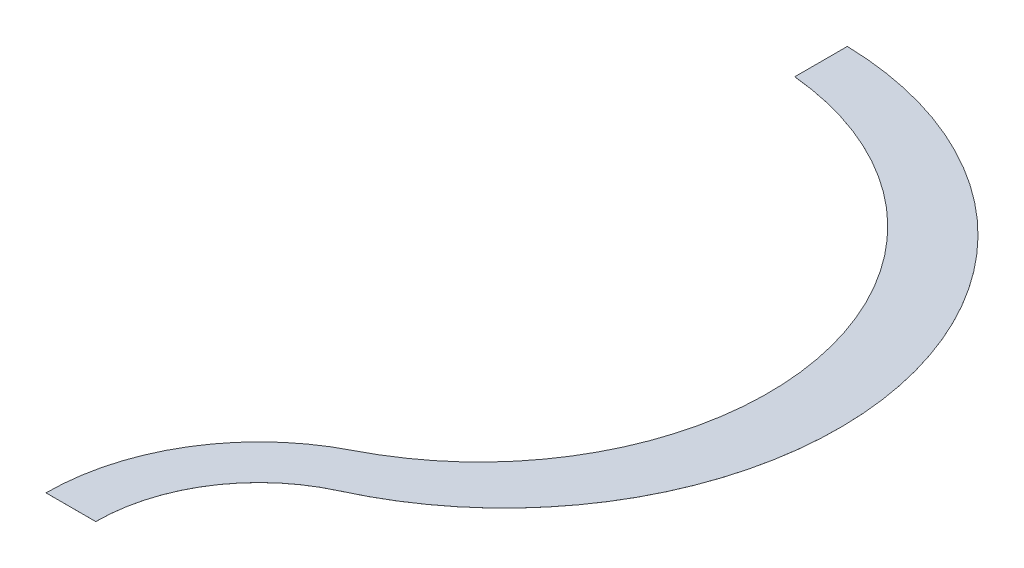
ISO-10303-21;
HEADER;
FILE_DESCRIPTION(('STEP AP214'),'2;1');
FILE_NAME('part.step','',(''),(''),'','','');
FILE_SCHEMA(('AUTOMOTIVE_DESIGN { 1 0 10303 214 1 1 1 1 }'));
ENDSEC;
DATA;
#1=APPLICATION_CONTEXT('core data for automotive mechanical design processes');
#2=APPLICATION_PROTOCOL_DEFINITION('international standard','automotive_design',2000,#1);
#3=PRODUCT_CONTEXT('',#1,'mechanical');
#4=PRODUCT('Part','Part','',(#3));
#5=PRODUCT_RELATED_PRODUCT_CATEGORY('part','',(#4));
#6=PRODUCT_DEFINITION_FORMATION('','',#4);
#7=PRODUCT_DEFINITION_CONTEXT('part definition',#1,'design');
#8=PRODUCT_DEFINITION('design','',#6,#7);
#9=PRODUCT_DEFINITION_SHAPE('','',#8);
#10=(LENGTH_UNIT() NAMED_UNIT(*) SI_UNIT(.MILLI.,.METRE.));
#11=(NAMED_UNIT(*) PLANE_ANGLE_UNIT() SI_UNIT($,.RADIAN.));
#12=(NAMED_UNIT(*) SI_UNIT($,.STERADIAN.) SOLID_ANGLE_UNIT());
#13=UNCERTAINTY_MEASURE_WITH_UNIT(LENGTH_MEASURE(1.E-05),#10,'distance_accuracy_value','');
#14=(GEOMETRIC_REPRESENTATION_CONTEXT(3) GLOBAL_UNCERTAINTY_ASSIGNED_CONTEXT((#13)) GLOBAL_UNIT_ASSIGNED_CONTEXT((#10,
#11,#12)) REPRESENTATION_CONTEXT('',''));
#15=CARTESIAN_POINT('',(0.,0.,0.));
#16=DIRECTION('',(0.,0.,1.));
#17=DIRECTION('',(1.,0.,0.));
#18=AXIS2_PLACEMENT_3D('',#15,#16,#17);
#19=CARTESIAN_POINT('',(378.845042115209,0.01,-791.249979553022));
#20=DIRECTION('',(0.,-1.,0.));
#21=DIRECTION('',(0.,0.,-1.));
#22=AXIS2_PLACEMENT_3D('',#19,#20,#21);
#23=CYLINDRICAL_SURFACE('',#22,81.1780801645515);
#24=CARTESIAN_POINT('',(378.845042115209,0.,-791.249979553022));
#25=DIRECTION('',(0.,-1.,0.));
#26=DIRECTION('',(0.,0.,-1.));
#27=AXIS2_PLACEMENT_3D('',#24,#25,#26);
#28=CIRCLE('',#27,81.1780801645515);
#29=CARTESIAN_POINT('',(297.666961950657,0.,-791.249979553022));
#30=VERTEX_POINT('',#29);
#31=CARTESIAN_POINT('',(342.105865491731,0.,-863.638608495911));
#32=VERTEX_POINT('',#31);
#33=EDGE_CURVE('E132',#30,#32,#28,.T.);
#34=ORIENTED_EDGE('',*,*,#33,.F.);
#35=DIRECTION('',(0.,-1.,0.));
#36=VECTOR('',#35,1.);
#37=CARTESIAN_POINT('',(297.666961950657,0.01,-791.249979553022));
#38=LINE('',#37,#36);
#39=CARTESIAN_POINT('',(297.666961950657,0.01,-791.249979553022));
#40=VERTEX_POINT('',#39);
#41=EDGE_CURVE('E11',#40,#30,#38,.T.);
#42=ORIENTED_EDGE('',*,*,#41,.F.);
#43=CARTESIAN_POINT('',(378.845042115209,0.01,-791.249979553022));
#44=DIRECTION('',(0.,-1.,0.));
#45=DIRECTION('',(0.,0.,-1.));
#46=AXIS2_PLACEMENT_3D('',#43,#44,#45);
#47=CIRCLE('',#46,81.1780801645515);
#48=CARTESIAN_POINT('',(342.105865491731,0.01,-863.638608495911));
#49=VERTEX_POINT('',#48);
#50=EDGE_CURVE('E150',#40,#49,#47,.T.);
#51=ORIENTED_EDGE('',*,*,#50,.T.);
#52=DIRECTION('',(0.,-1.,0.));
#53=VECTOR('',#52,1.);
#54=CARTESIAN_POINT('',(342.105865491731,0.01,-863.638608495911));
#55=LINE('',#54,#53);
#56=EDGE_CURVE('E42',#49,#32,#55,.T.);
#57=ORIENTED_EDGE('',*,*,#56,.T.);
#58=EDGE_LOOP('',(#34,#42,#51,#57));
#59=FACE_BOUND('',#58,.T.);
#60=ADVANCED_FACE('F39',(#59),#23,.T.);
#61=CARTESIAN_POINT('',(297.666961950657,0.01,-791.249979553022));
#62=DIRECTION('',(0.,0.,-1.));
#63=DIRECTION('',(-1.,0.,0.));
#64=AXIS2_PLACEMENT_3D('',#61,#62,#63);
#65=PLANE('',#64);
#66=DIRECTION('',(1.,0.,0.));
#67=VECTOR('',#66,1.);
#68=CARTESIAN_POINT('',(297.666961950657,0.,-791.249979553022));
#69=LINE('',#68,#67);
#70=CARTESIAN_POINT('',(316.601353193409,0.,-791.249979553022));
#71=VERTEX_POINT('',#70);
#72=EDGE_CURVE('E79',#30,#71,#69,.T.);
#73=ORIENTED_EDGE('',*,*,#72,.T.);
#74=DIRECTION('',(0.,-1.,0.));
#75=VECTOR('',#74,1.);
#76=CARTESIAN_POINT('',(316.601353193409,0.01,-791.249979553022));
#77=LINE('',#76,#75);
#78=CARTESIAN_POINT('',(316.601353193409,0.01,-791.249979553022));
#79=VERTEX_POINT('',#78);
#80=EDGE_CURVE('E49',#79,#71,#77,.T.);
#81=ORIENTED_EDGE('',*,*,#80,.F.);
#82=DIRECTION('',(1.,0.,0.));
#83=VECTOR('',#82,1.);
#84=CARTESIAN_POINT('',(297.666961950657,0.01,-791.249979553022));
#85=LINE('',#84,#83);
#86=EDGE_CURVE('E105',#40,#79,#85,.T.);
#87=ORIENTED_EDGE('',*,*,#86,.F.);
#88=ORIENTED_EDGE('',*,*,#41,.T.);
#89=EDGE_LOOP('',(#73,#81,#87,#88));
#90=FACE_BOUND('',#89,.T.);
#91=ADVANCED_FACE('F175',(#90),#65,.F.);
#92=CARTESIAN_POINT('',(378.726964475539,0.01,-791.249979553022));
#93=DIRECTION('',(0.,-1.,0.));
#94=DIRECTION('',(0.,0.,-1.));
#95=AXIS2_PLACEMENT_3D('',#92,#93,#94);
#96=CYLINDRICAL_SURFACE('',#95,62.1256112821295);
#97=CARTESIAN_POINT('',(378.726964475539,0.,-791.249979553022));
#98=DIRECTION('',(0.,-1.,0.));
#99=DIRECTION('',(0.,0.,-1.));
#100=AXIS2_PLACEMENT_3D('',#97,#98,#99);
#101=CIRCLE('',#100,62.1256112821295);
#102=CARTESIAN_POINT('',(352.905895621768,0.,-847.75541274689));
#103=VERTEX_POINT('',#102);
#104=EDGE_CURVE('E113',#71,#103,#101,.T.);
#105=ORIENTED_EDGE('',*,*,#104,.T.);
#106=DIRECTION('',(0.,-1.,0.));
#107=VECTOR('',#106,1.);
#108=CARTESIAN_POINT('',(352.905895621768,0.01,-847.75541274689));
#109=LINE('',#108,#107);
#110=CARTESIAN_POINT('',(352.905895621768,0.01,-847.75541274689));
#111=VERTEX_POINT('',#110);
#112=EDGE_CURVE('E110',#111,#103,#109,.T.);
#113=ORIENTED_EDGE('',*,*,#112,.F.);
#114=CARTESIAN_POINT('',(378.726964475539,0.01,-791.249979553022));
#115=DIRECTION('',(0.,-1.,0.));
#116=DIRECTION('',(0.,0.,-1.));
#117=AXIS2_PLACEMENT_3D('',#114,#115,#116);
#118=CIRCLE('',#117,62.1256112821295);
#119=EDGE_CURVE('E97',#79,#111,#118,.T.);
#120=ORIENTED_EDGE('',*,*,#119,.F.);
#121=ORIENTED_EDGE('',*,*,#80,.T.);
#122=EDGE_LOOP('',(#105,#113,#120,#121));
#123=FACE_BOUND('',#122,.T.);
#124=ADVANCED_FACE('F111',(#123),#96,.F.);
#125=CARTESIAN_POINT('',(299.967770082059,0.01,-963.60234894592));
#126=DIRECTION('',(0.,-1.,0.));
#127=DIRECTION('',(0.,0.,-1.));
#128=AXIS2_PLACEMENT_3D('',#125,#126,#127);
#129=CYLINDRICAL_SURFACE('',#128,127.369375292337);
#130=CARTESIAN_POINT('',(299.967770082059,0.,-963.60234894592));
#131=DIRECTION('',(0.,1.,0.));
#132=DIRECTION('',(0.,0.,1.));
#133=AXIS2_PLACEMENT_3D('',#130,#131,#132);
#134=CIRCLE('',#133,127.369375292337);
#135=CARTESIAN_POINT('',(303.015592938205,0.,-1090.9352533273));
#136=VERTEX_POINT('',#135);
#137=EDGE_CURVE('E144',#103,#136,#134,.T.);
#138=ORIENTED_EDGE('',*,*,#137,.T.);
#139=DIRECTION('',(0.,-1.,0.));
#140=VECTOR('',#139,1.);
#141=CARTESIAN_POINT('',(303.015592938205,0.01,-1090.9352533273));
#142=LINE('',#141,#140);
#143=CARTESIAN_POINT('',(303.015592938205,0.01,-1090.9352533273));
#144=VERTEX_POINT('',#143);
#145=EDGE_CURVE('E118',#144,#136,#142,.T.);
#146=ORIENTED_EDGE('',*,*,#145,.F.);
#147=CARTESIAN_POINT('',(299.967770082059,0.01,-963.60234894592));
#148=DIRECTION('',(0.,1.,0.));
#149=DIRECTION('',(0.,0.,1.));
#150=AXIS2_PLACEMENT_3D('',#147,#148,#149);
#151=CIRCLE('',#150,127.369375292337);
#152=EDGE_CURVE('E103',#111,#144,#151,.T.);
#153=ORIENTED_EDGE('',*,*,#152,.F.);
#154=ORIENTED_EDGE('',*,*,#112,.T.);
#155=EDGE_LOOP('',(#138,#146,#153,#154));
#156=FACE_BOUND('',#155,.T.);
#157=ADVANCED_FACE('F120',(#156),#129,.T.);
#158=CARTESIAN_POINT('',(303.015592938204,0.01,-1070.9352533273));
#159=DIRECTION('',(-1.,0.,0.));
#160=DIRECTION('',(0.,0.,1.));
#161=AXIS2_PLACEMENT_3D('',#158,#159,#160);
#162=PLANE('',#161);
#163=DIRECTION('',(0.,0.,-1.));
#164=VECTOR('',#163,1.);
#165=CARTESIAN_POINT('',(303.015592938204,0.,-1070.9352533273));
#166=LINE('',#165,#164);
#167=CARTESIAN_POINT('',(303.015592938204,0.,-1070.9352533273));
#168=VERTEX_POINT('',#167);
#169=EDGE_CURVE('E140',#168,#136,#166,.T.);
#170=ORIENTED_EDGE('',*,*,#169,.F.);
#171=DIRECTION('',(0.,-1.,0.));
#172=VECTOR('',#171,1.);
#173=CARTESIAN_POINT('',(303.015592938204,0.01,-1070.9352533273));
#174=LINE('',#173,#172);
#175=CARTESIAN_POINT('',(303.015592938204,0.01,-1070.9352533273));
#176=VERTEX_POINT('',#175);
#177=EDGE_CURVE('E155',#176,#168,#174,.T.);
#178=ORIENTED_EDGE('',*,*,#177,.F.);
#179=DIRECTION('',(0.,0.,-1.));
#180=VECTOR('',#179,1.);
#181=CARTESIAN_POINT('',(303.015592938204,0.01,-1070.9352533273));
#182=LINE('',#181,#180);
#183=EDGE_CURVE('E123',#176,#144,#182,.T.);
#184=ORIENTED_EDGE('',*,*,#183,.T.);
#185=ORIENTED_EDGE('',*,*,#145,.T.);
#186=EDGE_LOOP('',(#170,#178,#184,#185));
#187=FACE_BOUND('',#186,.T.);
#188=ADVANCED_FACE('F163',(#187),#162,.T.);
#189=CARTESIAN_POINT('',(292.389131940967,0.01,-961.597422710569));
#190=DIRECTION('',(0.,-1.,0.));
#191=DIRECTION('',(0.,0.,-1.));
#192=AXIS2_PLACEMENT_3D('',#189,#190,#191);
#193=CYLINDRICAL_SURFACE('',#192,109.853005772712);
#194=CARTESIAN_POINT('',(292.389131940967,0.,-961.597422710569));
#195=DIRECTION('',(0.,1.,0.));
#196=DIRECTION('',(0.,0.,1.));
#197=AXIS2_PLACEMENT_3D('',#194,#195,#196);
#198=CIRCLE('',#197,109.853005772712);
#199=EDGE_CURVE('E136',#32,#168,#198,.T.);
#200=ORIENTED_EDGE('',*,*,#199,.F.);
#201=ORIENTED_EDGE('',*,*,#56,.F.);
#202=CARTESIAN_POINT('',(292.389131940967,0.01,-961.597422710569));
#203=DIRECTION('',(0.,1.,0.));
#204=DIRECTION('',(0.,0.,1.));
#205=AXIS2_PLACEMENT_3D('',#202,#203,#204);
#206=CIRCLE('',#205,109.853005772712);
#207=EDGE_CURVE('E126',#49,#176,#206,.T.);
#208=ORIENTED_EDGE('',*,*,#207,.T.);
#209=ORIENTED_EDGE('',*,*,#177,.T.);
#210=EDGE_LOOP('',(#200,#201,#208,#209));
#211=FACE_BOUND('',#210,.T.);
#212=ADVANCED_FACE('F159',(#211),#193,.F.);
#213=CARTESIAN_POINT('',(378.845042115209,0.01,-791.249979553022));
#214=DIRECTION('',(0.,-1.,0.));
#215=DIRECTION('',(0.,0.,-1.));
#216=AXIS2_PLACEMENT_3D('',#213,#214,#215);
#217=PLANE('',#216);
#218=ORIENTED_EDGE('',*,*,#50,.F.);
#219=ORIENTED_EDGE('',*,*,#86,.T.);
#220=ORIENTED_EDGE('',*,*,#119,.T.);
#221=ORIENTED_EDGE('',*,*,#152,.T.);
#222=ORIENTED_EDGE('',*,*,#183,.F.);
#223=ORIENTED_EDGE('',*,*,#207,.F.);
#224=EDGE_LOOP('',(#218,#219,#220,#221,#222,#223));
#225=FACE_BOUND('',#224,.T.);
#226=ADVANCED_FACE('F100',(#225),#217,.F.);
#227=CARTESIAN_POINT('',(378.845042115209,0.,-791.249979553022));
#228=DIRECTION('',(0.,-1.,0.));
#229=DIRECTION('',(0.,0.,-1.));
#230=AXIS2_PLACEMENT_3D('',#227,#228,#229);
#231=PLANE('',#230);
#232=ORIENTED_EDGE('',*,*,#33,.T.);
#233=ORIENTED_EDGE('',*,*,#199,.T.);
#234=ORIENTED_EDGE('',*,*,#169,.T.);
#235=ORIENTED_EDGE('',*,*,#137,.F.);
#236=ORIENTED_EDGE('',*,*,#104,.F.);
#237=ORIENTED_EDGE('',*,*,#72,.F.);
#238=EDGE_LOOP('',(#232,#233,#234,#235,#236,#237));
#239=FACE_BOUND('',#238,.T.);
#240=ADVANCED_FACE('F161',(#239),#231,.T.);
#241=CLOSED_SHELL('',(#60,#91,#124,#157,#188,#212,#226,#240));
#242=MANIFOLD_SOLID_BREP('B2',#241);
#243=ADVANCED_BREP_SHAPE_REPRESENTATION('',(#18,#242),#14);
#244=SHAPE_DEFINITION_REPRESENTATION(#9,#243);
ENDSEC;
END-ISO-10303-21;
